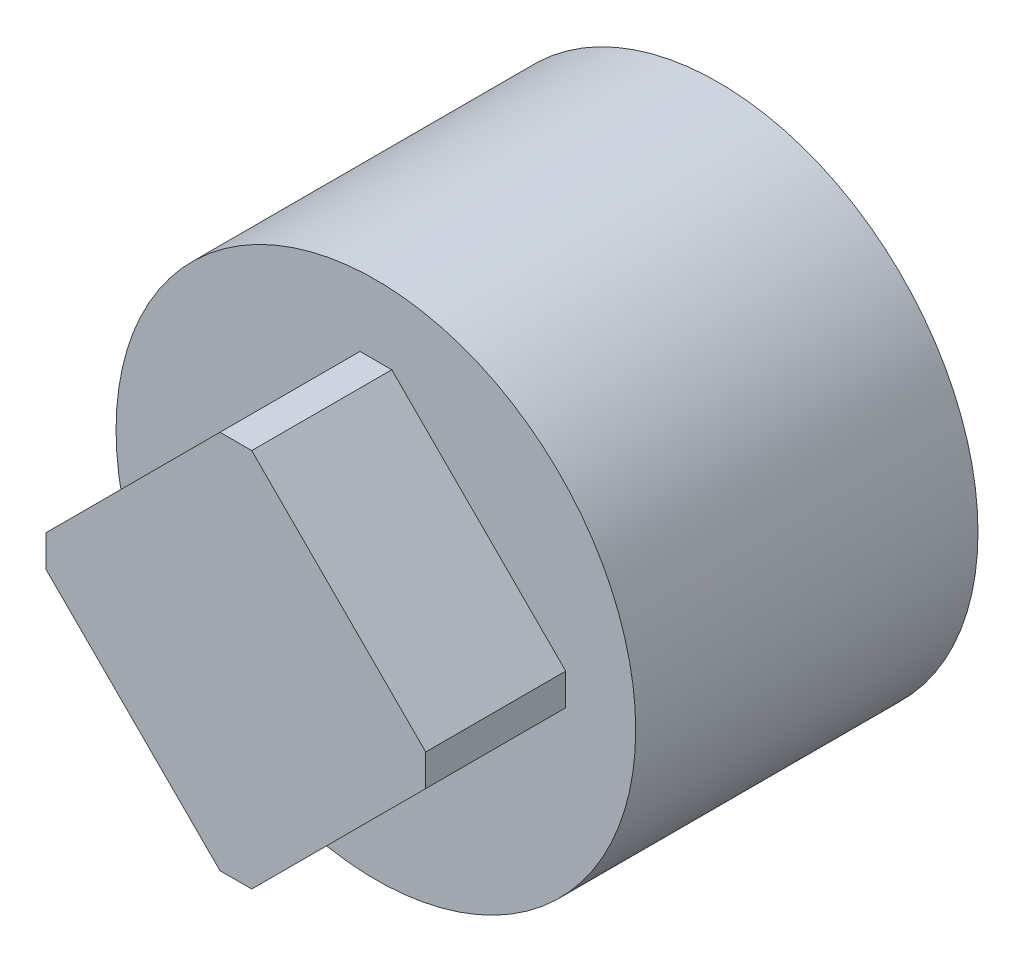
ISO-10303-21;
HEADER;
FILE_DESCRIPTION(('STEP AP214'),'2;1');
FILE_NAME('part.step','',(''),(''),'','','');
FILE_SCHEMA(('AUTOMOTIVE_DESIGN { 1 0 10303 214 1 1 1 1 }'));
ENDSEC;
DATA;
#1=APPLICATION_CONTEXT('core data for automotive mechanical design processes');
#2=APPLICATION_PROTOCOL_DEFINITION('international standard','automotive_design',2000,#1);
#3=PRODUCT_CONTEXT('',#1,'mechanical');
#4=PRODUCT('Part','Part','',(#3));
#5=PRODUCT_RELATED_PRODUCT_CATEGORY('part','',(#4));
#6=PRODUCT_DEFINITION_FORMATION('','',#4);
#7=PRODUCT_DEFINITION_CONTEXT('part definition',#1,'design');
#8=PRODUCT_DEFINITION('design','',#6,#7);
#9=PRODUCT_DEFINITION_SHAPE('','',#8);
#10=(LENGTH_UNIT() NAMED_UNIT(*) SI_UNIT(.MILLI.,.METRE.));
#11=(NAMED_UNIT(*) PLANE_ANGLE_UNIT() SI_UNIT($,.RADIAN.));
#12=(NAMED_UNIT(*) SI_UNIT($,.STERADIAN.) SOLID_ANGLE_UNIT());
#13=UNCERTAINTY_MEASURE_WITH_UNIT(LENGTH_MEASURE(1.E-05),#10,'distance_accuracy_value','');
#14=(GEOMETRIC_REPRESENTATION_CONTEXT(3) GLOBAL_UNCERTAINTY_ASSIGNED_CONTEXT((#13)) GLOBAL_UNIT_ASSIGNED_CONTEXT((#10,
#11,#12)) REPRESENTATION_CONTEXT('',''));
#15=CARTESIAN_POINT('',(0.,0.,0.));
#16=DIRECTION('',(0.,0.,1.));
#17=DIRECTION('',(1.,0.,0.));
#18=AXIS2_PLACEMENT_3D('',#15,#16,#17);
#19=CARTESIAN_POINT('',(0.,0.,1.));
#20=DIRECTION('',(0.,0.,1.));
#21=DIRECTION('',(1.,0.,0.));
#22=AXIS2_PLACEMENT_3D('',#19,#20,#21);
#23=PLANE('',#22);
#24=CARTESIAN_POINT('',(0.,0.,1.));
#25=DIRECTION('',(0.,0.,1.));
#26=DIRECTION('',(1.,0.,0.));
#27=AXIS2_PLACEMENT_3D('',#24,#25,#26);
#28=CIRCLE('',#27,10.2);
#29=CARTESIAN_POINT('',(10.2,0.,1.));
#30=VERTEX_POINT('',#29);
#31=EDGE_CURVE('E486',#30,#30,#28,.T.);
#32=ORIENTED_EDGE('',*,*,#31,.T.);
#33=EDGE_LOOP('',(#32));
#34=FACE_BOUND('',#33,.T.);
#35=CARTESIAN_POINT('',(0.,0.,1.));
#36=DIRECTION('',(0.,0.,1.));
#37=DIRECTION('',(1.,0.,0.));
#38=AXIS2_PLACEMENT_3D('',#35,#36,#37);
#39=CIRCLE('',#38,16.7);
#40=CARTESIAN_POINT('',(16.7,0.,1.));
#41=VERTEX_POINT('',#40);
#42=EDGE_CURVE('E260',#41,#41,#39,.T.);
#43=ORIENTED_EDGE('',*,*,#42,.F.);
#44=EDGE_LOOP('',(#43));
#45=FACE_BOUND('',#44,.T.);
#46=ADVANCED_FACE('F39',(#34,#45),#23,.F.);
#47=CARTESIAN_POINT('',(0.,0.,23.));
#48=DIRECTION('',(0.,0.,-1.));
#49=DIRECTION('',(-1.,0.,0.));
#50=AXIS2_PLACEMENT_3D('',#47,#48,#49);
#51=CYLINDRICAL_SURFACE('',#50,16.7);
#52=CARTESIAN_POINT('',(0.,0.,23.));
#53=DIRECTION('',(0.,0.,1.));
#54=DIRECTION('',(1.,0.,0.));
#55=AXIS2_PLACEMENT_3D('',#52,#53,#54);
#56=CIRCLE('',#55,16.7);
#57=CARTESIAN_POINT('',(16.7,0.,23.));
#58=VERTEX_POINT('',#57);
#59=EDGE_CURVE('E50',#58,#58,#56,.T.);
#60=ORIENTED_EDGE('',*,*,#59,.F.);
#61=EDGE_LOOP('',(#60));
#62=FACE_BOUND('',#61,.T.);
#63=ORIENTED_EDGE('',*,*,#42,.T.);
#64=EDGE_LOOP('',(#63));
#65=FACE_BOUND('',#64,.T.);
#66=ADVANCED_FACE('F41',(#62,#65),#51,.T.);
#67=CARTESIAN_POINT('',(0.,0.,23.));
#68=DIRECTION('',(0.,0.,1.));
#69=DIRECTION('',(1.,0.,0.));
#70=AXIS2_PLACEMENT_3D('',#67,#68,#69);
#71=PLANE('',#70);
#72=DIRECTION('',(-0.707106781186548,0.707106781186548,0.));
#73=VECTOR('',#72,1.);
#74=CARTESIAN_POINT('',(12.2028968081884,1.02,23.));
#75=LINE('',#74,#73);
#76=CARTESIAN_POINT('',(12.2028968081884,1.02,23.));
#77=VERTEX_POINT('',#76);
#78=CARTESIAN_POINT('',(1.02,12.2028968081884,23.));
#79=VERTEX_POINT('',#78);
#80=EDGE_CURVE('E62',#77,#79,#75,.T.);
#81=ORIENTED_EDGE('',*,*,#80,.F.);
#82=DIRECTION('',(0.,1.,0.));
#83=VECTOR('',#82,1.);
#84=CARTESIAN_POINT('',(12.2028968081884,-1.02,23.));
#85=LINE('',#84,#83);
#86=CARTESIAN_POINT('',(12.2028968081884,-1.02,23.));
#87=VERTEX_POINT('',#86);
#88=EDGE_CURVE('E200',#87,#77,#85,.T.);
#89=ORIENTED_EDGE('',*,*,#88,.F.);
#90=DIRECTION('',(0.707106781186548,0.707106781186548,0.));
#91=VECTOR('',#90,1.);
#92=CARTESIAN_POINT('',(1.02,-12.2028968081884,23.));
#93=LINE('',#92,#91);
#94=CARTESIAN_POINT('',(1.02,-12.2028968081884,23.));
#95=VERTEX_POINT('',#94);
#96=EDGE_CURVE('E229',#95,#87,#93,.T.);
#97=ORIENTED_EDGE('',*,*,#96,.F.);
#98=DIRECTION('',(1.,0.,0.));
#99=VECTOR('',#98,1.);
#100=CARTESIAN_POINT('',(-1.02,-12.2028968081884,23.));
#101=LINE('',#100,#99);
#102=CARTESIAN_POINT('',(-1.02,-12.2028968081884,23.));
#103=VERTEX_POINT('',#102);
#104=EDGE_CURVE('E227',#103,#95,#101,.T.);
#105=ORIENTED_EDGE('',*,*,#104,.F.);
#106=DIRECTION('',(0.707106781186548,-0.707106781186548,0.));
#107=VECTOR('',#106,1.);
#108=CARTESIAN_POINT('',(-12.2028968081884,-1.02,23.));
#109=LINE('',#108,#107);
#110=CARTESIAN_POINT('',(-12.2028968081884,-1.02,23.));
#111=VERTEX_POINT('',#110);
#112=EDGE_CURVE('E224',#111,#103,#109,.T.);
#113=ORIENTED_EDGE('',*,*,#112,.F.);
#114=DIRECTION('',(0.,-1.,0.));
#115=VECTOR('',#114,1.);
#116=CARTESIAN_POINT('',(-12.2028968081884,1.02,23.));
#117=LINE('',#116,#115);
#118=CARTESIAN_POINT('',(-12.2028968081884,1.02,23.));
#119=VERTEX_POINT('',#118);
#120=EDGE_CURVE('E223',#119,#111,#117,.T.);
#121=ORIENTED_EDGE('',*,*,#120,.F.);
#122=DIRECTION('',(-0.707106781186548,-0.707106781186548,0.));
#123=VECTOR('',#122,1.);
#124=CARTESIAN_POINT('',(-1.02,12.2028968081884,23.));
#125=LINE('',#124,#123);
#126=CARTESIAN_POINT('',(-1.02,12.2028968081884,23.));
#127=VERTEX_POINT('',#126);
#128=EDGE_CURVE('E217',#127,#119,#125,.T.);
#129=ORIENTED_EDGE('',*,*,#128,.F.);
#130=DIRECTION('',(-1.,0.,0.));
#131=VECTOR('',#130,1.);
#132=CARTESIAN_POINT('',(1.02,12.2028968081884,23.));
#133=LINE('',#132,#131);
#134=EDGE_CURVE('E213',#79,#127,#133,.T.);
#135=ORIENTED_EDGE('',*,*,#134,.F.);
#136=EDGE_LOOP('',(#81,#89,#97,#105,#113,#121,#129,#135));
#137=FACE_BOUND('',#136,.T.);
#138=ORIENTED_EDGE('',*,*,#59,.T.);
#139=EDGE_LOOP('',(#138));
#140=FACE_BOUND('',#139,.T.);
#141=ADVANCED_FACE('F267',(#137,#140),#71,.T.);
#142=CARTESIAN_POINT('',(12.2028968081884,1.02,32.));
#143=DIRECTION('',(-0.707106781186547,-0.707106781186547,0.));
#144=DIRECTION('',(0.707106781186548,-0.707106781186548,0.));
#145=AXIS2_PLACEMENT_3D('',#142,#143,#144);
#146=PLANE('',#145);
#147=ORIENTED_EDGE('',*,*,#80,.T.);
#148=DIRECTION('',(0.,0.,-1.));
#149=VECTOR('',#148,1.);
#150=CARTESIAN_POINT('',(1.02,12.2028968081884,32.));
#151=LINE('',#150,#149);
#152=CARTESIAN_POINT('',(1.02,12.2028968081884,32.));
#153=VERTEX_POINT('',#152);
#154=EDGE_CURVE('E251',#153,#79,#151,.T.);
#155=ORIENTED_EDGE('',*,*,#154,.F.);
#156=DIRECTION('',(-0.707106781186548,0.707106781186548,0.));
#157=VECTOR('',#156,1.);
#158=CARTESIAN_POINT('',(12.2028968081884,1.02,32.));
#159=LINE('',#158,#157);
#160=CARTESIAN_POINT('',(12.2028968081884,1.02,32.));
#161=VERTEX_POINT('',#160);
#162=EDGE_CURVE('E193',#161,#153,#159,.T.);
#163=ORIENTED_EDGE('',*,*,#162,.F.);
#164=DIRECTION('',(0.,0.,-1.));
#165=VECTOR('',#164,1.);
#166=CARTESIAN_POINT('',(12.2028968081884,1.02,32.));
#167=LINE('',#166,#165);
#168=EDGE_CURVE('E214',#161,#77,#167,.T.);
#169=ORIENTED_EDGE('',*,*,#168,.T.);
#170=EDGE_LOOP('',(#147,#155,#163,#169));
#171=FACE_BOUND('',#170,.T.);
#172=ADVANCED_FACE('F277',(#171),#146,.F.);
#173=CARTESIAN_POINT('',(1.02,12.2028968081884,32.));
#174=DIRECTION('',(0.,-1.,0.));
#175=DIRECTION('',(0.,0.,-1.));
#176=AXIS2_PLACEMENT_3D('',#173,#174,#175);
#177=PLANE('',#176);
#178=ORIENTED_EDGE('',*,*,#134,.T.);
#179=DIRECTION('',(0.,0.,-1.));
#180=VECTOR('',#179,1.);
#181=CARTESIAN_POINT('',(-1.02,12.2028968081884,32.));
#182=LINE('',#181,#180);
#183=CARTESIAN_POINT('',(-1.02,12.2028968081884,32.));
#184=VERTEX_POINT('',#183);
#185=EDGE_CURVE('E252',#184,#127,#182,.T.);
#186=ORIENTED_EDGE('',*,*,#185,.F.);
#187=DIRECTION('',(-1.,0.,0.));
#188=VECTOR('',#187,1.);
#189=CARTESIAN_POINT('',(1.02,12.2028968081884,32.));
#190=LINE('',#189,#188);
#191=EDGE_CURVE('E197',#153,#184,#190,.T.);
#192=ORIENTED_EDGE('',*,*,#191,.F.);
#193=ORIENTED_EDGE('',*,*,#154,.T.);
#194=EDGE_LOOP('',(#178,#186,#192,#193));
#195=FACE_BOUND('',#194,.T.);
#196=ADVANCED_FACE('F276',(#195),#177,.F.);
#197=CARTESIAN_POINT('',(-1.02,12.2028968081884,32.));
#198=DIRECTION('',(0.707106781186547,-0.707106781186547,0.));
#199=DIRECTION('',(0.707106781186548,0.707106781186548,0.));
#200=AXIS2_PLACEMENT_3D('',#197,#198,#199);
#201=PLANE('',#200);
#202=ORIENTED_EDGE('',*,*,#128,.T.);
#203=DIRECTION('',(0.,0.,-1.));
#204=VECTOR('',#203,1.);
#205=CARTESIAN_POINT('',(-12.2028968081884,1.02,32.));
#206=LINE('',#205,#204);
#207=CARTESIAN_POINT('',(-12.2028968081884,1.02,32.));
#208=VERTEX_POINT('',#207);
#209=EDGE_CURVE('E247',#208,#119,#206,.T.);
#210=ORIENTED_EDGE('',*,*,#209,.F.);
#211=DIRECTION('',(-0.707106781186548,-0.707106781186548,0.));
#212=VECTOR('',#211,1.);
#213=CARTESIAN_POINT('',(-1.02,12.2028968081884,32.));
#214=LINE('',#213,#212);
#215=EDGE_CURVE('E203',#184,#208,#214,.T.);
#216=ORIENTED_EDGE('',*,*,#215,.F.);
#217=ORIENTED_EDGE('',*,*,#185,.T.);
#218=EDGE_LOOP('',(#202,#210,#216,#217));
#219=FACE_BOUND('',#218,.T.);
#220=ADVANCED_FACE('F282',(#219),#201,.F.);
#221=CARTESIAN_POINT('',(-12.2028968081884,1.02,32.));
#222=DIRECTION('',(1.,0.,0.));
#223=DIRECTION('',(0.,0.,-1.));
#224=AXIS2_PLACEMENT_3D('',#221,#222,#223);
#225=PLANE('',#224);
#226=ORIENTED_EDGE('',*,*,#120,.T.);
#227=DIRECTION('',(0.,0.,-1.));
#228=VECTOR('',#227,1.);
#229=CARTESIAN_POINT('',(-12.2028968081884,-1.02,32.));
#230=LINE('',#229,#228);
#231=CARTESIAN_POINT('',(-12.2028968081884,-1.02,32.));
#232=VERTEX_POINT('',#231);
#233=EDGE_CURVE('E244',#232,#111,#230,.T.);
#234=ORIENTED_EDGE('',*,*,#233,.F.);
#235=DIRECTION('',(0.,-1.,0.));
#236=VECTOR('',#235,1.);
#237=CARTESIAN_POINT('',(-12.2028968081884,1.02,32.));
#238=LINE('',#237,#236);
#239=EDGE_CURVE('E201',#208,#232,#238,.T.);
#240=ORIENTED_EDGE('',*,*,#239,.F.);
#241=ORIENTED_EDGE('',*,*,#209,.T.);
#242=EDGE_LOOP('',(#226,#234,#240,#241));
#243=FACE_BOUND('',#242,.T.);
#244=ADVANCED_FACE('F290',(#243),#225,.F.);
#245=CARTESIAN_POINT('',(-12.2028968081884,-1.02,32.));
#246=DIRECTION('',(0.707106781186547,0.707106781186547,0.));
#247=DIRECTION('',(-0.707106781186548,0.707106781186548,0.));
#248=AXIS2_PLACEMENT_3D('',#245,#246,#247);
#249=PLANE('',#248);
#250=ORIENTED_EDGE('',*,*,#112,.T.);
#251=DIRECTION('',(0.,0.,-1.));
#252=VECTOR('',#251,1.);
#253=CARTESIAN_POINT('',(-1.02,-12.2028968081884,32.));
#254=LINE('',#253,#252);
#255=CARTESIAN_POINT('',(-1.02,-12.2028968081884,32.));
#256=VERTEX_POINT('',#255);
#257=EDGE_CURVE('E245',#256,#103,#254,.T.);
#258=ORIENTED_EDGE('',*,*,#257,.F.);
#259=DIRECTION('',(0.707106781186548,-0.707106781186548,0.));
#260=VECTOR('',#259,1.);
#261=CARTESIAN_POINT('',(-12.2028968081884,-1.02,32.));
#262=LINE('',#261,#260);
#263=EDGE_CURVE('E202',#232,#256,#262,.T.);
#264=ORIENTED_EDGE('',*,*,#263,.F.);
#265=ORIENTED_EDGE('',*,*,#233,.T.);
#266=EDGE_LOOP('',(#250,#258,#264,#265));
#267=FACE_BOUND('',#266,.T.);
#268=ADVANCED_FACE('F293',(#267),#249,.F.);
#269=CARTESIAN_POINT('',(-1.02,-12.2028968081884,32.));
#270=DIRECTION('',(0.,1.,0.));
#271=DIRECTION('',(0.,0.,1.));
#272=AXIS2_PLACEMENT_3D('',#269,#270,#271);
#273=PLANE('',#272);
#274=ORIENTED_EDGE('',*,*,#104,.T.);
#275=DIRECTION('',(0.,0.,-1.));
#276=VECTOR('',#275,1.);
#277=CARTESIAN_POINT('',(1.02,-12.2028968081884,32.));
#278=LINE('',#277,#276);
#279=CARTESIAN_POINT('',(1.02,-12.2028968081884,32.));
#280=VERTEX_POINT('',#279);
#281=EDGE_CURVE('E237',#280,#95,#278,.T.);
#282=ORIENTED_EDGE('',*,*,#281,.F.);
#283=DIRECTION('',(1.,0.,0.));
#284=VECTOR('',#283,1.);
#285=CARTESIAN_POINT('',(-1.02,-12.2028968081884,32.));
#286=LINE('',#285,#284);
#287=EDGE_CURVE('E210',#256,#280,#286,.T.);
#288=ORIENTED_EDGE('',*,*,#287,.F.);
#289=ORIENTED_EDGE('',*,*,#257,.T.);
#290=EDGE_LOOP('',(#274,#282,#288,#289));
#291=FACE_BOUND('',#290,.T.);
#292=ADVANCED_FACE('F294',(#291),#273,.F.);
#293=CARTESIAN_POINT('',(1.02,-12.2028968081884,32.));
#294=DIRECTION('',(-0.707106781186547,0.707106781186547,0.));
#295=DIRECTION('',(-0.707106781186548,-0.707106781186548,0.));
#296=AXIS2_PLACEMENT_3D('',#293,#294,#295);
#297=PLANE('',#296);
#298=ORIENTED_EDGE('',*,*,#96,.T.);
#299=DIRECTION('',(0.,0.,-1.));
#300=VECTOR('',#299,1.);
#301=CARTESIAN_POINT('',(12.2028968081884,-1.02,32.));
#302=LINE('',#301,#300);
#303=CARTESIAN_POINT('',(12.2028968081884,-1.02,32.));
#304=VERTEX_POINT('',#303);
#305=EDGE_CURVE('E236',#304,#87,#302,.T.);
#306=ORIENTED_EDGE('',*,*,#305,.F.);
#307=DIRECTION('',(0.707106781186548,0.707106781186548,0.));
#308=VECTOR('',#307,1.);
#309=CARTESIAN_POINT('',(1.02,-12.2028968081884,32.));
#310=LINE('',#309,#308);
#311=EDGE_CURVE('E209',#280,#304,#310,.T.);
#312=ORIENTED_EDGE('',*,*,#311,.F.);
#313=ORIENTED_EDGE('',*,*,#281,.T.);
#314=EDGE_LOOP('',(#298,#306,#312,#313));
#315=FACE_BOUND('',#314,.T.);
#316=ADVANCED_FACE('F299',(#315),#297,.F.);
#317=CARTESIAN_POINT('',(12.2028968081884,-1.02,32.));
#318=DIRECTION('',(-1.,0.,0.));
#319=DIRECTION('',(0.,0.,1.));
#320=AXIS2_PLACEMENT_3D('',#317,#318,#319);
#321=PLANE('',#320);
#322=ORIENTED_EDGE('',*,*,#88,.T.);
#323=ORIENTED_EDGE('',*,*,#168,.F.);
#324=DIRECTION('',(0.,1.,0.));
#325=VECTOR('',#324,1.);
#326=CARTESIAN_POINT('',(12.2028968081884,-1.02,32.));
#327=LINE('',#326,#325);
#328=EDGE_CURVE('E212',#304,#161,#327,.T.);
#329=ORIENTED_EDGE('',*,*,#328,.F.);
#330=ORIENTED_EDGE('',*,*,#305,.T.);
#331=EDGE_LOOP('',(#322,#323,#329,#330));
#332=FACE_BOUND('',#331,.T.);
#333=ADVANCED_FACE('F303',(#332),#321,.F.);
#334=CARTESIAN_POINT('',(0.,0.,32.));
#335=DIRECTION('',(0.,0.,1.));
#336=DIRECTION('',(1.,0.,0.));
#337=AXIS2_PLACEMENT_3D('',#334,#335,#336);
#338=PLANE('',#337);
#339=ORIENTED_EDGE('',*,*,#162,.T.);
#340=ORIENTED_EDGE('',*,*,#191,.T.);
#341=ORIENTED_EDGE('',*,*,#215,.T.);
#342=ORIENTED_EDGE('',*,*,#239,.T.);
#343=ORIENTED_EDGE('',*,*,#263,.T.);
#344=ORIENTED_EDGE('',*,*,#287,.T.);
#345=ORIENTED_EDGE('',*,*,#311,.T.);
#346=ORIENTED_EDGE('',*,*,#328,.T.);
#347=EDGE_LOOP('',(#339,#340,#341,#342,#343,#344,#345,#346));
#348=FACE_BOUND('',#347,.T.);
#349=ADVANCED_FACE('F310',(#348),#338,.T.);
#350=CARTESIAN_POINT('',(0.,0.,2.1));
#351=DIRECTION('',(0.,0.,-1.));
#352=DIRECTION('',(-1.,0.,0.));
#353=AXIS2_PLACEMENT_3D('',#350,#351,#352);
#354=CYLINDRICAL_SURFACE('',#353,10.2);
#355=CARTESIAN_POINT('',(0.,0.,2.1));
#356=DIRECTION('',(0.,0.,1.));
#357=DIRECTION('',(1.,0.,0.));
#358=AXIS2_PLACEMENT_3D('',#355,#356,#357);
#359=CIRCLE('',#358,10.2);
#360=CARTESIAN_POINT('',(10.2,0.,2.1));
#361=VERTEX_POINT('',#360);
#362=EDGE_CURVE('E488',#361,#361,#359,.T.);
#363=ORIENTED_EDGE('',*,*,#362,.T.);
#364=EDGE_LOOP('',(#363));
#365=FACE_BOUND('',#364,.T.);
#366=ORIENTED_EDGE('',*,*,#31,.F.);
#367=EDGE_LOOP('',(#366));
#368=FACE_BOUND('',#367,.T.);
#369=ADVANCED_FACE('F311',(#365,#368),#354,.F.);
#370=CARTESIAN_POINT('',(0.,0.,2.1));
#371=DIRECTION('',(0.,0.,1.));
#372=DIRECTION('',(1.,0.,0.));
#373=AXIS2_PLACEMENT_3D('',#370,#371,#372);
#374=PLANE('',#373);
#375=DIRECTION('',(-0.707106781186548,0.707106781186548,0.));
#376=VECTOR('',#375,1.);
#377=CARTESIAN_POINT('',(9.02091629284897,1.02,2.1));
#378=LINE('',#377,#376);
#379=CARTESIAN_POINT('',(9.02091629284897,1.02,2.1));
#380=VERTEX_POINT('',#379);
#381=CARTESIAN_POINT('',(1.02,9.02091629284897,2.1));
#382=VERTEX_POINT('',#381);
#383=EDGE_CURVE('E153',#380,#382,#378,.T.);
#384=ORIENTED_EDGE('',*,*,#383,.T.);
#385=DIRECTION('',(-1.,0.,0.));
#386=VECTOR('',#385,1.);
#387=CARTESIAN_POINT('',(1.02,9.02091629284897,2.1));
#388=LINE('',#387,#386);
#389=CARTESIAN_POINT('',(-1.02,9.02091629284897,2.1));
#390=VERTEX_POINT('',#389);
#391=EDGE_CURVE('E170',#382,#390,#388,.T.);
#392=ORIENTED_EDGE('',*,*,#391,.T.);
#393=DIRECTION('',(-0.707106781186548,-0.707106781186548,0.));
#394=VECTOR('',#393,1.);
#395=CARTESIAN_POINT('',(-1.02,9.02091629284897,2.1));
#396=LINE('',#395,#394);
#397=CARTESIAN_POINT('',(-9.02091629284897,1.02,2.1));
#398=VERTEX_POINT('',#397);
#399=EDGE_CURVE('E497',#390,#398,#396,.T.);
#400=ORIENTED_EDGE('',*,*,#399,.T.);
#401=DIRECTION('',(0.,-1.,0.));
#402=VECTOR('',#401,1.);
#403=CARTESIAN_POINT('',(-9.02091629284897,1.02,2.1));
#404=LINE('',#403,#402);
#405=CARTESIAN_POINT('',(-9.02091629284897,-1.02,2.1));
#406=VERTEX_POINT('',#405);
#407=EDGE_CURVE('E500',#398,#406,#404,.T.);
#408=ORIENTED_EDGE('',*,*,#407,.T.);
#409=DIRECTION('',(0.707106781186548,-0.707106781186548,0.));
#410=VECTOR('',#409,1.);
#411=CARTESIAN_POINT('',(-9.02091629284897,-1.02,2.1));
#412=LINE('',#411,#410);
#413=CARTESIAN_POINT('',(-1.02,-9.02091629284897,2.1));
#414=VERTEX_POINT('',#413);
#415=EDGE_CURVE('E492',#406,#414,#412,.T.);
#416=ORIENTED_EDGE('',*,*,#415,.T.);
#417=DIRECTION('',(1.,0.,0.));
#418=VECTOR('',#417,1.);
#419=CARTESIAN_POINT('',(-1.02,-9.02091629284897,2.1));
#420=LINE('',#419,#418);
#421=CARTESIAN_POINT('',(1.02,-9.02091629284897,2.1));
#422=VERTEX_POINT('',#421);
#423=EDGE_CURVE('E491',#414,#422,#420,.T.);
#424=ORIENTED_EDGE('',*,*,#423,.T.);
#425=DIRECTION('',(0.707106781186548,0.707106781186548,0.));
#426=VECTOR('',#425,1.);
#427=CARTESIAN_POINT('',(1.02,-9.02091629284897,2.1));
#428=LINE('',#427,#426);
#429=CARTESIAN_POINT('',(9.02091629284897,-1.02,2.1));
#430=VERTEX_POINT('',#429);
#431=EDGE_CURVE('E52',#422,#430,#428,.T.);
#432=ORIENTED_EDGE('',*,*,#431,.T.);
#433=DIRECTION('',(0.,1.,0.));
#434=VECTOR('',#433,1.);
#435=CARTESIAN_POINT('',(9.02091629284897,-1.02,2.1));
#436=LINE('',#435,#434);
#437=EDGE_CURVE('E11',#430,#380,#436,.T.);
#438=ORIENTED_EDGE('',*,*,#437,.T.);
#439=EDGE_LOOP('',(#384,#392,#400,#408,#416,#424,#432,#438));
#440=FACE_BOUND('',#439,.T.);
#441=ORIENTED_EDGE('',*,*,#362,.F.);
#442=EDGE_LOOP('',(#441));
#443=FACE_BOUND('',#442,.T.);
#444=ADVANCED_FACE('F146',(#440,#443),#374,.F.);
#445=CARTESIAN_POINT('',(0.,0.,20.1));
#446=DIRECTION('',(0.,0.,1.));
#447=DIRECTION('',(1.,0.,0.));
#448=AXIS2_PLACEMENT_3D('',#445,#446,#447);
#449=PLANE('',#448);
#450=DIRECTION('',(-0.707106781186548,0.707106781186548,0.));
#451=VECTOR('',#450,1.);
#452=CARTESIAN_POINT('',(9.02091629284897,1.02,20.1));
#453=LINE('',#452,#451);
#454=CARTESIAN_POINT('',(9.02091629284897,1.02,20.1));
#455=VERTEX_POINT('',#454);
#456=CARTESIAN_POINT('',(1.02,9.02091629284897,20.1));
#457=VERTEX_POINT('',#456);
#458=EDGE_CURVE('E168',#455,#457,#453,.T.);
#459=ORIENTED_EDGE('',*,*,#458,.F.);
#460=DIRECTION('',(0.,1.,0.));
#461=VECTOR('',#460,1.);
#462=CARTESIAN_POINT('',(9.02091629284897,-1.02,20.1));
#463=LINE('',#462,#461);
#464=CARTESIAN_POINT('',(9.02091629284897,-1.02,20.1));
#465=VERTEX_POINT('',#464);
#466=EDGE_CURVE('E171',#465,#455,#463,.T.);
#467=ORIENTED_EDGE('',*,*,#466,.F.);
#468=DIRECTION('',(0.707106781186548,0.707106781186548,0.));
#469=VECTOR('',#468,1.);
#470=CARTESIAN_POINT('',(1.02,-9.02091629284897,20.1));
#471=LINE('',#470,#469);
#472=CARTESIAN_POINT('',(1.02,-9.02091629284897,20.1));
#473=VERTEX_POINT('',#472);
#474=EDGE_CURVE('E176',#473,#465,#471,.T.);
#475=ORIENTED_EDGE('',*,*,#474,.F.);
#476=DIRECTION('',(1.,0.,0.));
#477=VECTOR('',#476,1.);
#478=CARTESIAN_POINT('',(-1.02,-9.02091629284897,20.1));
#479=LINE('',#478,#477);
#480=CARTESIAN_POINT('',(-1.02,-9.02091629284897,20.1));
#481=VERTEX_POINT('',#480);
#482=EDGE_CURVE('E512',#481,#473,#479,.T.);
#483=ORIENTED_EDGE('',*,*,#482,.F.);
#484=DIRECTION('',(0.707106781186548,-0.707106781186548,0.));
#485=VECTOR('',#484,1.);
#486=CARTESIAN_POINT('',(-9.02091629284897,-1.02,20.1));
#487=LINE('',#486,#485);
#488=CARTESIAN_POINT('',(-9.02091629284897,-1.02,20.1));
#489=VERTEX_POINT('',#488);
#490=EDGE_CURVE('E508',#489,#481,#487,.T.);
#491=ORIENTED_EDGE('',*,*,#490,.F.);
#492=DIRECTION('',(0.,-1.,0.));
#493=VECTOR('',#492,1.);
#494=CARTESIAN_POINT('',(-9.02091629284897,1.02,20.1));
#495=LINE('',#494,#493);
#496=CARTESIAN_POINT('',(-9.02091629284897,1.02,20.1));
#497=VERTEX_POINT('',#496);
#498=EDGE_CURVE('E510',#497,#489,#495,.T.);
#499=ORIENTED_EDGE('',*,*,#498,.F.);
#500=DIRECTION('',(-0.707106781186548,-0.707106781186548,0.));
#501=VECTOR('',#500,1.);
#502=CARTESIAN_POINT('',(-1.02,9.02091629284897,20.1));
#503=LINE('',#502,#501);
#504=CARTESIAN_POINT('',(-1.02,9.02091629284897,20.1));
#505=VERTEX_POINT('',#504);
#506=EDGE_CURVE('E504',#505,#497,#503,.T.);
#507=ORIENTED_EDGE('',*,*,#506,.F.);
#508=DIRECTION('',(-1.,0.,0.));
#509=VECTOR('',#508,1.);
#510=CARTESIAN_POINT('',(1.02,9.02091629284897,20.1));
#511=LINE('',#510,#509);
#512=EDGE_CURVE('E503',#457,#505,#511,.T.);
#513=ORIENTED_EDGE('',*,*,#512,.F.);
#514=EDGE_LOOP('',(#459,#467,#475,#483,#491,#499,#507,#513));
#515=FACE_BOUND('',#514,.T.);
#516=ADVANCED_FACE('F342',(#515),#449,.F.);
#517=CARTESIAN_POINT('',(9.02091629284897,-1.02,20.1));
#518=DIRECTION('',(-1.,0.,0.));
#519=DIRECTION('',(0.,0.,1.));
#520=AXIS2_PLACEMENT_3D('',#517,#518,#519);
#521=PLANE('',#520);
#522=ORIENTED_EDGE('',*,*,#437,.F.);
#523=DIRECTION('',(0.,0.,-1.));
#524=VECTOR('',#523,1.);
#525=CARTESIAN_POINT('',(9.02091629284897,-1.02,20.1));
#526=LINE('',#525,#524);
#527=EDGE_CURVE('E175',#465,#430,#526,.T.);
#528=ORIENTED_EDGE('',*,*,#527,.F.);
#529=ORIENTED_EDGE('',*,*,#466,.T.);
#530=DIRECTION('',(0.,0.,-1.));
#531=VECTOR('',#530,1.);
#532=CARTESIAN_POINT('',(9.02091629284897,1.02,20.1));
#533=LINE('',#532,#531);
#534=EDGE_CURVE('E162',#455,#380,#533,.T.);
#535=ORIENTED_EDGE('',*,*,#534,.T.);
#536=EDGE_LOOP('',(#522,#528,#529,#535));
#537=FACE_BOUND('',#536,.T.);
#538=ADVANCED_FACE('F169',(#537),#521,.T.);
#539=CARTESIAN_POINT('',(1.02,-9.02091629284897,20.1));
#540=DIRECTION('',(-0.707106781186548,0.707106781186548,0.));
#541=DIRECTION('',(-0.707106781186548,-0.707106781186548,0.));
#542=AXIS2_PLACEMENT_3D('',#539,#540,#541);
#543=PLANE('',#542);
#544=ORIENTED_EDGE('',*,*,#431,.F.);
#545=DIRECTION('',(0.,0.,-1.));
#546=VECTOR('',#545,1.);
#547=CARTESIAN_POINT('',(1.02,-9.02091629284897,20.1));
#548=LINE('',#547,#546);
#549=EDGE_CURVE('E172',#473,#422,#548,.T.);
#550=ORIENTED_EDGE('',*,*,#549,.F.);
#551=ORIENTED_EDGE('',*,*,#474,.T.);
#552=ORIENTED_EDGE('',*,*,#527,.T.);
#553=EDGE_LOOP('',(#544,#550,#551,#552));
#554=FACE_BOUND('',#553,.T.);
#555=ADVANCED_FACE('F334',(#554),#543,.T.);
#556=CARTESIAN_POINT('',(-1.02,-9.02091629284897,20.1));
#557=DIRECTION('',(0.,1.,0.));
#558=DIRECTION('',(0.,0.,1.));
#559=AXIS2_PLACEMENT_3D('',#556,#557,#558);
#560=PLANE('',#559);
#561=ORIENTED_EDGE('',*,*,#423,.F.);
#562=DIRECTION('',(0.,0.,-1.));
#563=VECTOR('',#562,1.);
#564=CARTESIAN_POINT('',(-1.02,-9.02091629284897,20.1));
#565=LINE('',#564,#563);
#566=EDGE_CURVE('E185',#481,#414,#565,.T.);
#567=ORIENTED_EDGE('',*,*,#566,.F.);
#568=ORIENTED_EDGE('',*,*,#482,.T.);
#569=ORIENTED_EDGE('',*,*,#549,.T.);
#570=EDGE_LOOP('',(#561,#567,#568,#569));
#571=FACE_BOUND('',#570,.T.);
#572=ADVANCED_FACE('F326',(#571),#560,.T.);
#573=CARTESIAN_POINT('',(-9.02091629284897,-1.02,20.1));
#574=DIRECTION('',(0.707106781186548,0.707106781186548,0.));
#575=DIRECTION('',(-0.707106781186548,0.707106781186548,0.));
#576=AXIS2_PLACEMENT_3D('',#573,#574,#575);
#577=PLANE('',#576);
#578=ORIENTED_EDGE('',*,*,#415,.F.);
#579=DIRECTION('',(0.,0.,-1.));
#580=VECTOR('',#579,1.);
#581=CARTESIAN_POINT('',(-9.02091629284897,-1.02,20.1));
#582=LINE('',#581,#580);
#583=EDGE_CURVE('E184',#489,#406,#582,.T.);
#584=ORIENTED_EDGE('',*,*,#583,.F.);
#585=ORIENTED_EDGE('',*,*,#490,.T.);
#586=ORIENTED_EDGE('',*,*,#566,.T.);
#587=EDGE_LOOP('',(#578,#584,#585,#586));
#588=FACE_BOUND('',#587,.T.);
#589=ADVANCED_FACE('F328',(#588),#577,.T.);
#590=CARTESIAN_POINT('',(-9.02091629284897,1.02,20.1));
#591=DIRECTION('',(1.,0.,0.));
#592=DIRECTION('',(0.,0.,-1.));
#593=AXIS2_PLACEMENT_3D('',#590,#591,#592);
#594=PLANE('',#593);
#595=ORIENTED_EDGE('',*,*,#407,.F.);
#596=DIRECTION('',(0.,0.,-1.));
#597=VECTOR('',#596,1.);
#598=CARTESIAN_POINT('',(-9.02091629284897,1.02,20.1));
#599=LINE('',#598,#597);
#600=EDGE_CURVE('E189',#497,#398,#599,.T.);
#601=ORIENTED_EDGE('',*,*,#600,.F.);
#602=ORIENTED_EDGE('',*,*,#498,.T.);
#603=ORIENTED_EDGE('',*,*,#583,.T.);
#604=EDGE_LOOP('',(#595,#601,#602,#603));
#605=FACE_BOUND('',#604,.T.);
#606=ADVANCED_FACE('F325',(#605),#594,.T.);
#607=CARTESIAN_POINT('',(-1.02,9.02091629284897,20.1));
#608=DIRECTION('',(0.707106781186548,-0.707106781186548,0.));
#609=DIRECTION('',(0.707106781186548,0.707106781186548,0.));
#610=AXIS2_PLACEMENT_3D('',#607,#608,#609);
#611=PLANE('',#610);
#612=ORIENTED_EDGE('',*,*,#399,.F.);
#613=DIRECTION('',(0.,0.,-1.));
#614=VECTOR('',#613,1.);
#615=CARTESIAN_POINT('',(-1.02,9.02091629284897,20.1));
#616=LINE('',#615,#614);
#617=EDGE_CURVE('E192',#505,#390,#616,.T.);
#618=ORIENTED_EDGE('',*,*,#617,.F.);
#619=ORIENTED_EDGE('',*,*,#506,.T.);
#620=ORIENTED_EDGE('',*,*,#600,.T.);
#621=EDGE_LOOP('',(#612,#618,#619,#620));
#622=FACE_BOUND('',#621,.T.);
#623=ADVANCED_FACE('F319',(#622),#611,.T.);
#624=CARTESIAN_POINT('',(1.02,9.02091629284897,20.1));
#625=DIRECTION('',(0.,-1.,0.));
#626=DIRECTION('',(0.,0.,-1.));
#627=AXIS2_PLACEMENT_3D('',#624,#625,#626);
#628=PLANE('',#627);
#629=ORIENTED_EDGE('',*,*,#391,.F.);
#630=DIRECTION('',(0.,0.,-1.));
#631=VECTOR('',#630,1.);
#632=CARTESIAN_POINT('',(1.02,9.02091629284897,20.1));
#633=LINE('',#632,#631);
#634=EDGE_CURVE('E164',#457,#382,#633,.T.);
#635=ORIENTED_EDGE('',*,*,#634,.F.);
#636=ORIENTED_EDGE('',*,*,#512,.T.);
#637=ORIENTED_EDGE('',*,*,#617,.T.);
#638=EDGE_LOOP('',(#629,#635,#636,#637));
#639=FACE_BOUND('',#638,.T.);
#640=ADVANCED_FACE('F314',(#639),#628,.T.);
#641=CARTESIAN_POINT('',(9.02091629284897,1.02,20.1));
#642=DIRECTION('',(-0.707106781186548,-0.707106781186548,0.));
#643=DIRECTION('',(0.707106781186548,-0.707106781186548,0.));
#644=AXIS2_PLACEMENT_3D('',#641,#642,#643);
#645=PLANE('',#644);
#646=ORIENTED_EDGE('',*,*,#383,.F.);
#647=ORIENTED_EDGE('',*,*,#534,.F.);
#648=ORIENTED_EDGE('',*,*,#458,.T.);
#649=ORIENTED_EDGE('',*,*,#634,.T.);
#650=EDGE_LOOP('',(#646,#647,#648,#649));
#651=FACE_BOUND('',#650,.T.);
#652=ADVANCED_FACE('F157',(#651),#645,.T.);
#653=CLOSED_SHELL('',(#46,#66,#141,#172,#196,#220,#244,#268,#292,#316,#333,#349,#369,#444,#516,
#538,#555,#572,#589,#606,#623,#640,#652));
#654=MANIFOLD_SOLID_BREP('B2',#653);
#655=ADVANCED_BREP_SHAPE_REPRESENTATION('',(#18,#654),#14);
#656=SHAPE_DEFINITION_REPRESENTATION(#9,#655);
ENDSEC;
END-ISO-10303-21;
